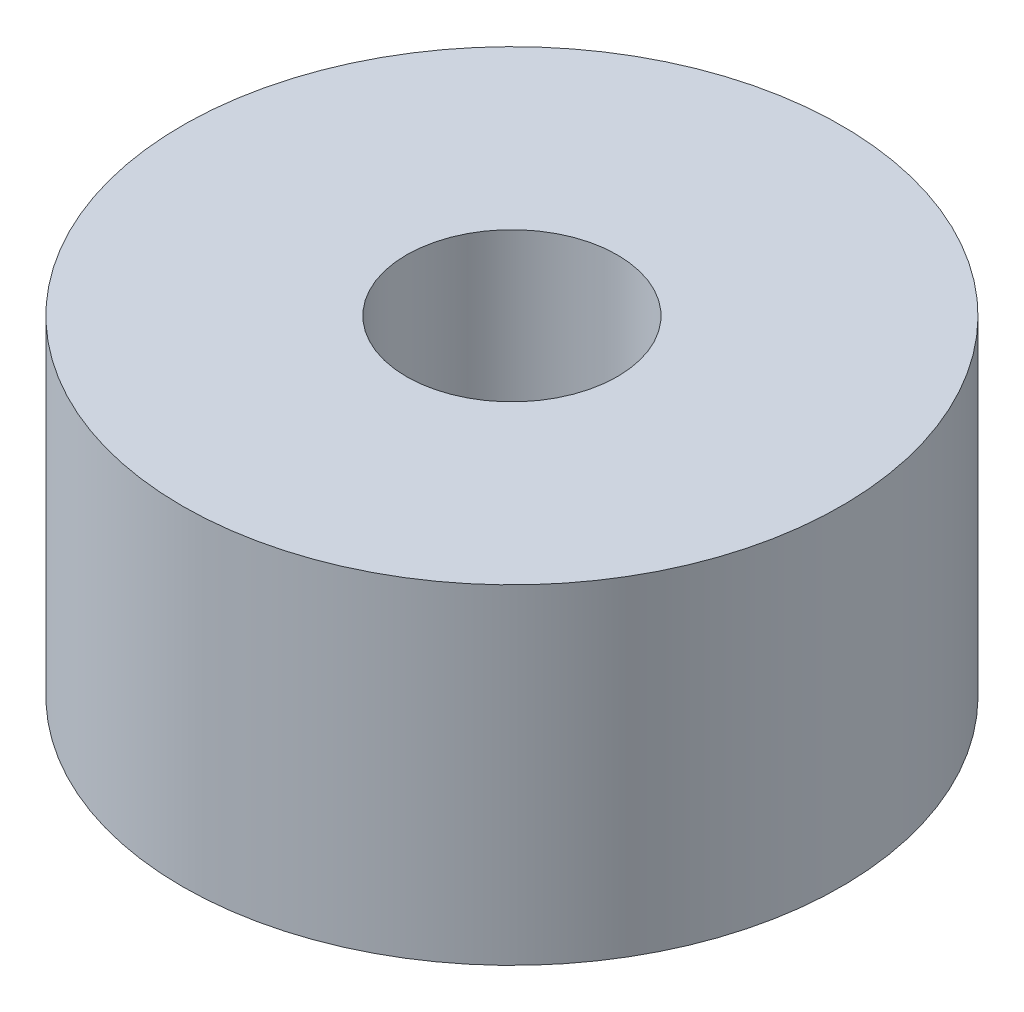
ISO-10303-21;
HEADER;
FILE_DESCRIPTION(('STEP AP214'),'2;1');
FILE_NAME('part.step','',(''),(''),'','','');
FILE_SCHEMA(('AUTOMOTIVE_DESIGN { 1 0 10303 214 1 1 1 1 }'));
ENDSEC;
DATA;
#1=APPLICATION_CONTEXT('core data for automotive mechanical design processes');
#2=APPLICATION_PROTOCOL_DEFINITION('international standard','automotive_design',2000,#1);
#3=PRODUCT_CONTEXT('',#1,'mechanical');
#4=PRODUCT('Part','Part','',(#3));
#5=PRODUCT_RELATED_PRODUCT_CATEGORY('part','',(#4));
#6=PRODUCT_DEFINITION_FORMATION('','',#4);
#7=PRODUCT_DEFINITION_CONTEXT('part definition',#1,'design');
#8=PRODUCT_DEFINITION('design','',#6,#7);
#9=PRODUCT_DEFINITION_SHAPE('','',#8);
#10=(LENGTH_UNIT() NAMED_UNIT(*) SI_UNIT(.MILLI.,.METRE.));
#11=(NAMED_UNIT(*) PLANE_ANGLE_UNIT() SI_UNIT($,.RADIAN.));
#12=(NAMED_UNIT(*) SI_UNIT($,.STERADIAN.) SOLID_ANGLE_UNIT());
#13=UNCERTAINTY_MEASURE_WITH_UNIT(LENGTH_MEASURE(1.E-05),#10,'distance_accuracy_value','');
#14=(GEOMETRIC_REPRESENTATION_CONTEXT(3) GLOBAL_UNCERTAINTY_ASSIGNED_CONTEXT((#13)) GLOBAL_UNIT_ASSIGNED_CONTEXT((#10,
#11,#12)) REPRESENTATION_CONTEXT('',''));
#15=CARTESIAN_POINT('',(0.,0.,0.));
#16=DIRECTION('',(0.,0.,1.));
#17=DIRECTION('',(1.,0.,0.));
#18=AXIS2_PLACEMENT_3D('',#15,#16,#17);
#19=CARTESIAN_POINT('',(0.,5.,0.));
#20=DIRECTION('',(0.,1.,0.));
#21=DIRECTION('',(0.,0.,1.));
#22=AXIS2_PLACEMENT_3D('',#19,#20,#21);
#23=PLANE('',#22);
#24=CARTESIAN_POINT('',(0.,5.,0.));
#25=DIRECTION('',(0.,1.,0.));
#26=DIRECTION('',(0.,0.,1.));
#27=AXIS2_PLACEMENT_3D('',#24,#25,#26);
#28=CIRCLE('',#27,5.);
#29=CARTESIAN_POINT('',(0.,5.,5.));
#30=VERTEX_POINT('',#29);
#31=EDGE_CURVE('E10',#30,#30,#28,.T.);
#32=ORIENTED_EDGE('',*,*,#31,.T.);
#33=EDGE_LOOP('',(#32));
#34=FACE_BOUND('',#33,.T.);
#35=CARTESIAN_POINT('',(0.,5.,0.));
#36=DIRECTION('',(0.,1.,0.));
#37=DIRECTION('',(0.,0.,1.));
#38=AXIS2_PLACEMENT_3D('',#35,#36,#37);
#39=CIRCLE('',#38,1.6);
#40=CARTESIAN_POINT('',(0.,5.,1.6));
#41=VERTEX_POINT('',#40);
#42=EDGE_CURVE('E44',#41,#41,#39,.T.);
#43=ORIENTED_EDGE('',*,*,#42,.F.);
#44=EDGE_LOOP('',(#43));
#45=FACE_BOUND('',#44,.T.);
#46=ADVANCED_FACE('F33',(#34,#45),#23,.T.);
#47=CARTESIAN_POINT('',(0.,0.,0.));
#48=DIRECTION('',(0.,1.,0.));
#49=DIRECTION('',(0.,0.,1.));
#50=AXIS2_PLACEMENT_3D('',#47,#48,#49);
#51=PLANE('',#50);
#52=CARTESIAN_POINT('',(0.,0.,0.));
#53=DIRECTION('',(0.,1.,0.));
#54=DIRECTION('',(0.,0.,1.));
#55=AXIS2_PLACEMENT_3D('',#52,#53,#54);
#56=CIRCLE('',#55,5.);
#57=CARTESIAN_POINT('',(0.,0.,5.));
#58=VERTEX_POINT('',#57);
#59=EDGE_CURVE('E37',#58,#58,#56,.T.);
#60=ORIENTED_EDGE('',*,*,#59,.F.);
#61=EDGE_LOOP('',(#60));
#62=FACE_BOUND('',#61,.T.);
#63=CARTESIAN_POINT('',(0.,0.,0.));
#64=DIRECTION('',(0.,1.,0.));
#65=DIRECTION('',(0.,0.,1.));
#66=AXIS2_PLACEMENT_3D('',#63,#64,#65);
#67=CIRCLE('',#66,1.6);
#68=CARTESIAN_POINT('',(0.,0.,1.6));
#69=VERTEX_POINT('',#68);
#70=EDGE_CURVE('E46',#69,#69,#67,.T.);
#71=ORIENTED_EDGE('',*,*,#70,.T.);
#72=EDGE_LOOP('',(#71));
#73=FACE_BOUND('',#72,.T.);
#74=ADVANCED_FACE('F56',(#62,#73),#51,.F.);
#75=CARTESIAN_POINT('',(0.,5.,0.));
#76=DIRECTION('',(0.,-1.,0.));
#77=DIRECTION('',(0.,0.,-1.));
#78=AXIS2_PLACEMENT_3D('',#75,#76,#77);
#79=CYLINDRICAL_SURFACE('',#78,5.);
#80=ORIENTED_EDGE('',*,*,#31,.F.);
#81=EDGE_LOOP('',(#80));
#82=FACE_BOUND('',#81,.T.);
#83=ORIENTED_EDGE('',*,*,#59,.T.);
#84=EDGE_LOOP('',(#83));
#85=FACE_BOUND('',#84,.T.);
#86=ADVANCED_FACE('F35',(#82,#85),#79,.T.);
#87=CARTESIAN_POINT('',(0.,5.,0.));
#88=DIRECTION('',(0.,-1.,0.));
#89=DIRECTION('',(0.,0.,-1.));
#90=AXIS2_PLACEMENT_3D('',#87,#88,#89);
#91=CYLINDRICAL_SURFACE('',#90,1.6);
#92=ORIENTED_EDGE('',*,*,#42,.T.);
#93=EDGE_LOOP('',(#92));
#94=FACE_BOUND('',#93,.T.);
#95=ORIENTED_EDGE('',*,*,#70,.F.);
#96=EDGE_LOOP('',(#95));
#97=FACE_BOUND('',#96,.T.);
#98=ADVANCED_FACE('F52',(#94,#97),#91,.F.);
#99=CLOSED_SHELL('',(#46,#74,#86,#98));
#100=MANIFOLD_SOLID_BREP('B2',#99);
#101=ADVANCED_BREP_SHAPE_REPRESENTATION('',(#18,#100),#14);
#102=SHAPE_DEFINITION_REPRESENTATION(#9,#101);
ENDSEC;
END-ISO-10303-21;
